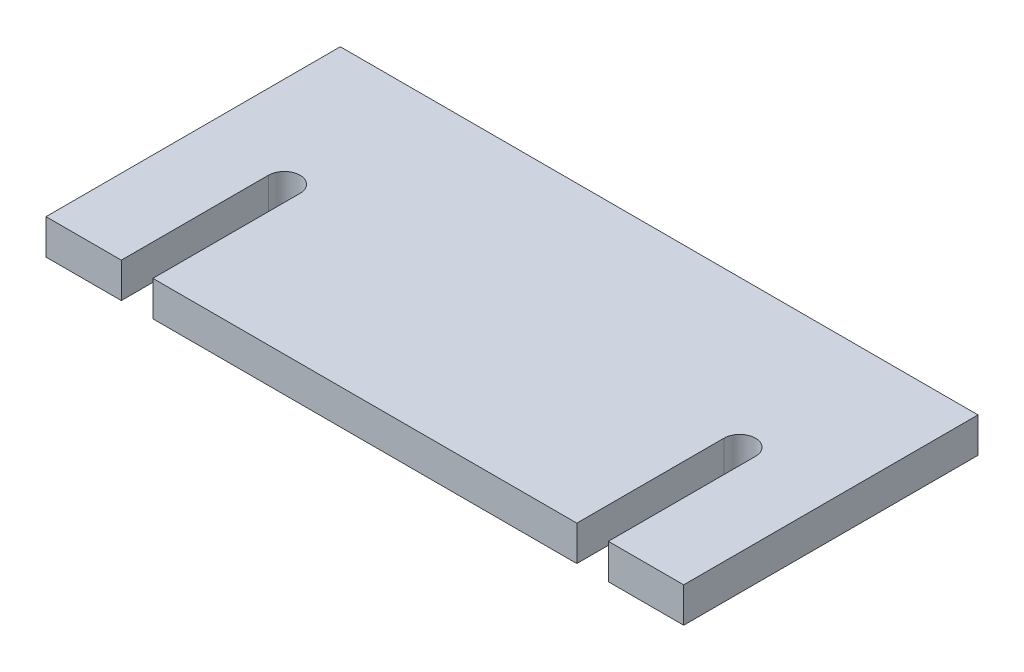
ISO-10303-21;
HEADER;
FILE_DESCRIPTION(('STEP AP214'),'2;1');
FILE_NAME('part.step','',(''),(''),'','','');
FILE_SCHEMA(('AUTOMOTIVE_DESIGN { 1 0 10303 214 1 1 1 1 }'));
ENDSEC;
DATA;
#1=APPLICATION_CONTEXT('core data for automotive mechanical design processes');
#2=APPLICATION_PROTOCOL_DEFINITION('international standard','automotive_design',2000,#1);
#3=PRODUCT_CONTEXT('',#1,'mechanical');
#4=PRODUCT('Part','Part','',(#3));
#5=PRODUCT_RELATED_PRODUCT_CATEGORY('part','',(#4));
#6=PRODUCT_DEFINITION_FORMATION('','',#4);
#7=PRODUCT_DEFINITION_CONTEXT('part definition',#1,'design');
#8=PRODUCT_DEFINITION('design','',#6,#7);
#9=PRODUCT_DEFINITION_SHAPE('','',#8);
#10=(LENGTH_UNIT() NAMED_UNIT(*) SI_UNIT(.MILLI.,.METRE.));
#11=(NAMED_UNIT(*) PLANE_ANGLE_UNIT() SI_UNIT($,.RADIAN.));
#12=(NAMED_UNIT(*) SI_UNIT($,.STERADIAN.) SOLID_ANGLE_UNIT());
#13=UNCERTAINTY_MEASURE_WITH_UNIT(LENGTH_MEASURE(1.E-05),#10,'distance_accuracy_value','');
#14=(GEOMETRIC_REPRESENTATION_CONTEXT(3) GLOBAL_UNCERTAINTY_ASSIGNED_CONTEXT((#13)) GLOBAL_UNIT_ASSIGNED_CONTEXT((#10,
#11,#12)) REPRESENTATION_CONTEXT('',''));
#15=CARTESIAN_POINT('',(0.,0.,0.));
#16=DIRECTION('',(0.,0.,1.));
#17=DIRECTION('',(1.,0.,0.));
#18=AXIS2_PLACEMENT_3D('',#15,#16,#17);
#19=CARTESIAN_POINT('',(-45.5,5.,21.));
#20=DIRECTION('',(0.,0.,-1.));
#21=DIRECTION('',(-1.,0.,0.));
#22=AXIS2_PLACEMENT_3D('',#19,#20,#21);
#23=PLANE('',#22);
#24=DIRECTION('',(1.,0.,0.));
#25=VECTOR('',#24,1.);
#26=CARTESIAN_POINT('',(-45.5,5.,21.));
#27=LINE('',#26,#25);
#28=CARTESIAN_POINT('',(-30.25,5.,21.));
#29=VERTEX_POINT('',#28);
#30=CARTESIAN_POINT('',(30.25,5.,21.));
#31=VERTEX_POINT('',#30);
#32=EDGE_CURVE('E198',#29,#31,#27,.T.);
#33=ORIENTED_EDGE('',*,*,#32,.F.);
#34=DIRECTION('',(0.,1.,0.));
#35=VECTOR('',#34,1.);
#36=CARTESIAN_POINT('',(-30.25,0.,21.));
#37=LINE('',#36,#35);
#38=CARTESIAN_POINT('',(-30.25,0.,21.));
#39=VERTEX_POINT('',#38);
#40=EDGE_CURVE('E156',#39,#29,#37,.T.);
#41=ORIENTED_EDGE('',*,*,#40,.F.);
#42=DIRECTION('',(1.,0.,0.));
#43=VECTOR('',#42,1.);
#44=CARTESIAN_POINT('',(-45.5,0.,21.));
#45=LINE('',#44,#43);
#46=CARTESIAN_POINT('',(30.25,0.,21.));
#47=VERTEX_POINT('',#46);
#48=EDGE_CURVE('E58',#39,#47,#45,.T.);
#49=ORIENTED_EDGE('',*,*,#48,.T.);
#50=DIRECTION('',(0.,1.,0.));
#51=VECTOR('',#50,1.);
#52=CARTESIAN_POINT('',(30.25,0.,21.));
#53=LINE('',#52,#51);
#54=EDGE_CURVE('E182',#47,#31,#53,.T.);
#55=ORIENTED_EDGE('',*,*,#54,.T.);
#56=EDGE_LOOP('',(#33,#41,#49,#55));
#57=FACE_BOUND('',#56,.T.);
#58=ADVANCED_FACE('F35',(#57),#23,.F.);
#59=CARTESIAN_POINT('',(34.75,5.,21.));
#60=VERTEX_POINT('',#59);
#61=CARTESIAN_POINT('',(45.5,5.,21.));
#62=VERTEX_POINT('',#61);
#63=EDGE_CURVE('E193',#60,#62,#27,.T.);
#64=ORIENTED_EDGE('',*,*,#63,.F.);
#65=DIRECTION('',(0.,1.,0.));
#66=VECTOR('',#65,1.);
#67=CARTESIAN_POINT('',(34.75,0.,21.));
#68=LINE('',#67,#66);
#69=CARTESIAN_POINT('',(34.75,0.,21.));
#70=VERTEX_POINT('',#69);
#71=EDGE_CURVE('E180',#70,#60,#68,.T.);
#72=ORIENTED_EDGE('',*,*,#71,.F.);
#73=CARTESIAN_POINT('',(45.5,0.,21.));
#74=VERTEX_POINT('',#73);
#75=EDGE_CURVE('E205',#70,#74,#45,.T.);
#76=ORIENTED_EDGE('',*,*,#75,.T.);
#77=DIRECTION('',(0.,-1.,0.));
#78=VECTOR('',#77,1.);
#79=CARTESIAN_POINT('',(45.5,5.,21.));
#80=LINE('',#79,#78);
#81=EDGE_CURVE('E197',#62,#74,#80,.T.);
#82=ORIENTED_EDGE('',*,*,#81,.F.);
#83=EDGE_LOOP('',(#64,#72,#76,#82));
#84=FACE_BOUND('',#83,.T.);
#85=ADVANCED_FACE('F234',(#84),#23,.F.);
#86=CARTESIAN_POINT('',(45.5,5.,21.));
#87=DIRECTION('',(-1.,0.,0.));
#88=DIRECTION('',(0.,0.,1.));
#89=AXIS2_PLACEMENT_3D('',#86,#87,#88);
#90=PLANE('',#89);
#91=DIRECTION('',(0.,0.,-1.));
#92=VECTOR('',#91,1.);
#93=CARTESIAN_POINT('',(45.5,0.,21.));
#94=LINE('',#93,#92);
#95=CARTESIAN_POINT('',(45.5,0.,-21.));
#96=VERTEX_POINT('',#95);
#97=EDGE_CURVE('E179',#74,#96,#94,.T.);
#98=ORIENTED_EDGE('',*,*,#97,.T.);
#99=DIRECTION('',(0.,-1.,0.));
#100=VECTOR('',#99,1.);
#101=CARTESIAN_POINT('',(45.5,5.,-21.));
#102=LINE('',#101,#100);
#103=CARTESIAN_POINT('',(45.5,5.,-21.));
#104=VERTEX_POINT('',#103);
#105=EDGE_CURVE('E11',#104,#96,#102,.T.);
#106=ORIENTED_EDGE('',*,*,#105,.F.);
#107=DIRECTION('',(0.,0.,-1.));
#108=VECTOR('',#107,1.);
#109=CARTESIAN_POINT('',(45.5,5.,21.));
#110=LINE('',#109,#108);
#111=EDGE_CURVE('E185',#62,#104,#110,.T.);
#112=ORIENTED_EDGE('',*,*,#111,.F.);
#113=ORIENTED_EDGE('',*,*,#81,.T.);
#114=EDGE_LOOP('',(#98,#106,#112,#113));
#115=FACE_BOUND('',#114,.T.);
#116=ADVANCED_FACE('F37',(#115),#90,.F.);
#117=CARTESIAN_POINT('',(-45.5,5.,-21.));
#118=DIRECTION('',(0.,0.,1.));
#119=DIRECTION('',(1.,0.,0.));
#120=AXIS2_PLACEMENT_3D('',#117,#118,#119);
#121=PLANE('',#120);
#122=DIRECTION('',(-1.,0.,0.));
#123=VECTOR('',#122,1.);
#124=CARTESIAN_POINT('',(-45.5,0.,-21.));
#125=LINE('',#124,#123);
#126=CARTESIAN_POINT('',(-45.5,0.,-21.));
#127=VERTEX_POINT('',#126);
#128=EDGE_CURVE('E201',#96,#127,#125,.T.);
#129=ORIENTED_EDGE('',*,*,#128,.T.);
#130=DIRECTION('',(0.,-1.,0.));
#131=VECTOR('',#130,1.);
#132=CARTESIAN_POINT('',(-45.5,5.,-21.));
#133=LINE('',#132,#131);
#134=CARTESIAN_POINT('',(-45.5,5.,-21.));
#135=VERTEX_POINT('',#134);
#136=EDGE_CURVE('E43',#135,#127,#133,.T.);
#137=ORIENTED_EDGE('',*,*,#136,.F.);
#138=DIRECTION('',(-1.,0.,0.));
#139=VECTOR('',#138,1.);
#140=CARTESIAN_POINT('',(-45.5,5.,-21.));
#141=LINE('',#140,#139);
#142=EDGE_CURVE('E188',#104,#135,#141,.T.);
#143=ORIENTED_EDGE('',*,*,#142,.F.);
#144=ORIENTED_EDGE('',*,*,#105,.T.);
#145=EDGE_LOOP('',(#129,#137,#143,#144));
#146=FACE_BOUND('',#145,.T.);
#147=ADVANCED_FACE('F227',(#146),#121,.F.);
#148=CARTESIAN_POINT('',(-45.5,5.,21.));
#149=DIRECTION('',(1.,0.,0.));
#150=DIRECTION('',(0.,0.,-1.));
#151=AXIS2_PLACEMENT_3D('',#148,#149,#150);
#152=PLANE('',#151);
#153=DIRECTION('',(0.,0.,1.));
#154=VECTOR('',#153,1.);
#155=CARTESIAN_POINT('',(-45.5,0.,21.));
#156=LINE('',#155,#154);
#157=CARTESIAN_POINT('',(-45.5,0.,21.));
#158=VERTEX_POINT('',#157);
#159=EDGE_CURVE('E203',#127,#158,#156,.T.);
#160=ORIENTED_EDGE('',*,*,#159,.T.);
#161=DIRECTION('',(0.,-1.,0.));
#162=VECTOR('',#161,1.);
#163=CARTESIAN_POINT('',(-45.5,5.,21.));
#164=LINE('',#163,#162);
#165=CARTESIAN_POINT('',(-45.5,5.,21.));
#166=VERTEX_POINT('',#165);
#167=EDGE_CURVE('E209',#166,#158,#164,.T.);
#168=ORIENTED_EDGE('',*,*,#167,.F.);
#169=DIRECTION('',(0.,0.,1.));
#170=VECTOR('',#169,1.);
#171=CARTESIAN_POINT('',(-45.5,5.,21.));
#172=LINE('',#171,#170);
#173=EDGE_CURVE('E191',#135,#166,#172,.T.);
#174=ORIENTED_EDGE('',*,*,#173,.F.);
#175=ORIENTED_EDGE('',*,*,#136,.T.);
#176=EDGE_LOOP('',(#160,#168,#174,#175));
#177=FACE_BOUND('',#176,.T.);
#178=ADVANCED_FACE('F216',(#177),#152,.F.);
#179=CARTESIAN_POINT('',(-34.75,0.,21.));
#180=VERTEX_POINT('',#179);
#181=EDGE_CURVE('E189',#158,#180,#45,.T.);
#182=ORIENTED_EDGE('',*,*,#181,.T.);
#183=DIRECTION('',(0.,1.,0.));
#184=VECTOR('',#183,1.);
#185=CARTESIAN_POINT('',(-34.75,0.,21.));
#186=LINE('',#185,#184);
#187=CARTESIAN_POINT('',(-34.75,5.,21.));
#188=VERTEX_POINT('',#187);
#189=EDGE_CURVE('E50',#180,#188,#186,.T.);
#190=ORIENTED_EDGE('',*,*,#189,.T.);
#191=EDGE_CURVE('E194',#166,#188,#27,.T.);
#192=ORIENTED_EDGE('',*,*,#191,.F.);
#193=ORIENTED_EDGE('',*,*,#167,.T.);
#194=EDGE_LOOP('',(#182,#190,#192,#193));
#195=FACE_BOUND('',#194,.T.);
#196=ADVANCED_FACE('F221',(#195),#23,.F.);
#197=CARTESIAN_POINT('',(0.,5.,0.));
#198=DIRECTION('',(0.,-1.,0.));
#199=DIRECTION('',(0.,0.,-1.));
#200=AXIS2_PLACEMENT_3D('',#197,#198,#199);
#201=PLANE('',#200);
#202=CARTESIAN_POINT('',(-32.5,5.,0.));
#203=DIRECTION('',(0.,1.,0.));
#204=DIRECTION('',(0.,0.,1.));
#205=AXIS2_PLACEMENT_3D('',#202,#203,#204);
#206=CIRCLE('',#205,2.25000000000001);
#207=CARTESIAN_POINT('',(-30.25,5.,0.));
#208=VERTEX_POINT('',#207);
#209=CARTESIAN_POINT('',(-34.75,5.,0.));
#210=VERTEX_POINT('',#209);
#211=EDGE_CURVE('E133',#208,#210,#206,.T.);
#212=ORIENTED_EDGE('',*,*,#211,.F.);
#213=DIRECTION('',(0.,0.,-1.));
#214=VECTOR('',#213,1.);
#215=CARTESIAN_POINT('',(-30.25,5.,0.));
#216=LINE('',#215,#214);
#217=EDGE_CURVE('E144',#29,#208,#216,.T.);
#218=ORIENTED_EDGE('',*,*,#217,.F.);
#219=ORIENTED_EDGE('',*,*,#32,.T.);
#220=DIRECTION('',(0.,0.,1.));
#221=VECTOR('',#220,1.);
#222=CARTESIAN_POINT('',(30.25,5.,0.));
#223=LINE('',#222,#221);
#224=CARTESIAN_POINT('',(30.25,5.,0.));
#225=VERTEX_POINT('',#224);
#226=EDGE_CURVE('E172',#225,#31,#223,.T.);
#227=ORIENTED_EDGE('',*,*,#226,.F.);
#228=CARTESIAN_POINT('',(32.5,5.,0.));
#229=DIRECTION('',(0.,1.,0.));
#230=DIRECTION('',(0.,0.,1.));
#231=AXIS2_PLACEMENT_3D('',#228,#229,#230);
#232=CIRCLE('',#231,2.24999999999999);
#233=CARTESIAN_POINT('',(34.75,5.,0.));
#234=VERTEX_POINT('',#233);
#235=EDGE_CURVE('E155',#234,#225,#232,.T.);
#236=ORIENTED_EDGE('',*,*,#235,.F.);
#237=DIRECTION('',(0.,0.,-1.));
#238=VECTOR('',#237,1.);
#239=CARTESIAN_POINT('',(34.75,5.,0.));
#240=LINE('',#239,#238);
#241=EDGE_CURVE('E163',#60,#234,#240,.T.);
#242=ORIENTED_EDGE('',*,*,#241,.F.);
#243=ORIENTED_EDGE('',*,*,#63,.T.);
#244=ORIENTED_EDGE('',*,*,#111,.T.);
#245=ORIENTED_EDGE('',*,*,#142,.T.);
#246=ORIENTED_EDGE('',*,*,#173,.T.);
#247=ORIENTED_EDGE('',*,*,#191,.T.);
#248=DIRECTION('',(0.,0.,1.));
#249=VECTOR('',#248,1.);
#250=CARTESIAN_POINT('',(-34.75,5.,0.));
#251=LINE('',#250,#249);
#252=EDGE_CURVE('E147',#210,#188,#251,.T.);
#253=ORIENTED_EDGE('',*,*,#252,.F.);
#254=EDGE_LOOP('',(#212,#218,#219,#227,#236,#242,#243,#244,#245,#246,#247,#253));
#255=FACE_BOUND('',#254,.T.);
#256=ADVANCED_FACE('F224',(#255),#201,.F.);
#257=CARTESIAN_POINT('',(0.,0.,0.));
#258=DIRECTION('',(0.,-1.,0.));
#259=DIRECTION('',(0.,0.,-1.));
#260=AXIS2_PLACEMENT_3D('',#257,#258,#259);
#261=PLANE('',#260);
#262=DIRECTION('',(0.,0.,-1.));
#263=VECTOR('',#262,1.);
#264=CARTESIAN_POINT('',(-30.25,0.,0.));
#265=LINE('',#264,#263);
#266=CARTESIAN_POINT('',(-30.25,0.,0.));
#267=VERTEX_POINT('',#266);
#268=EDGE_CURVE('E135',#39,#267,#265,.T.);
#269=ORIENTED_EDGE('',*,*,#268,.T.);
#270=CARTESIAN_POINT('',(-32.5,0.,0.));
#271=DIRECTION('',(0.,1.,0.));
#272=DIRECTION('',(0.,0.,1.));
#273=AXIS2_PLACEMENT_3D('',#270,#271,#272);
#274=CIRCLE('',#273,2.25000000000001);
#275=CARTESIAN_POINT('',(-34.75,0.,0.));
#276=VERTEX_POINT('',#275);
#277=EDGE_CURVE('E130',#267,#276,#274,.T.);
#278=ORIENTED_EDGE('',*,*,#277,.T.);
#279=DIRECTION('',(0.,0.,1.));
#280=VECTOR('',#279,1.);
#281=CARTESIAN_POINT('',(-34.75,0.,0.));
#282=LINE('',#281,#280);
#283=EDGE_CURVE('E137',#276,#180,#282,.T.);
#284=ORIENTED_EDGE('',*,*,#283,.T.);
#285=ORIENTED_EDGE('',*,*,#181,.F.);
#286=ORIENTED_EDGE('',*,*,#159,.F.);
#287=ORIENTED_EDGE('',*,*,#128,.F.);
#288=ORIENTED_EDGE('',*,*,#97,.F.);
#289=ORIENTED_EDGE('',*,*,#75,.F.);
#290=DIRECTION('',(0.,0.,-1.));
#291=VECTOR('',#290,1.);
#292=CARTESIAN_POINT('',(34.75,0.,0.));
#293=LINE('',#292,#291);
#294=CARTESIAN_POINT('',(34.75,0.,0.));
#295=VERTEX_POINT('',#294);
#296=EDGE_CURVE('E166',#70,#295,#293,.T.);
#297=ORIENTED_EDGE('',*,*,#296,.T.);
#298=CARTESIAN_POINT('',(32.5,0.,0.));
#299=DIRECTION('',(0.,1.,0.));
#300=DIRECTION('',(0.,0.,1.));
#301=AXIS2_PLACEMENT_3D('',#298,#299,#300);
#302=CIRCLE('',#301,2.24999999999999);
#303=CARTESIAN_POINT('',(30.25,0.,0.));
#304=VERTEX_POINT('',#303);
#305=EDGE_CURVE('E159',#295,#304,#302,.T.);
#306=ORIENTED_EDGE('',*,*,#305,.T.);
#307=DIRECTION('',(0.,0.,1.));
#308=VECTOR('',#307,1.);
#309=CARTESIAN_POINT('',(30.25,0.,0.));
#310=LINE('',#309,#308);
#311=EDGE_CURVE('E162',#304,#47,#310,.T.);
#312=ORIENTED_EDGE('',*,*,#311,.T.);
#313=ORIENTED_EDGE('',*,*,#48,.F.);
#314=EDGE_LOOP('',(#269,#278,#284,#285,#286,#287,#288,#289,#297,#306,#312,#313));
#315=FACE_BOUND('',#314,.T.);
#316=ADVANCED_FACE('F143',(#315),#261,.T.);
#317=CARTESIAN_POINT('',(32.5,0.,0.));
#318=DIRECTION('',(0.,1.,0.));
#319=DIRECTION('',(0.,0.,1.));
#320=AXIS2_PLACEMENT_3D('',#317,#318,#319);
#321=CYLINDRICAL_SURFACE('',#320,2.24999999999999);
#322=ORIENTED_EDGE('',*,*,#235,.T.);
#323=DIRECTION('',(0.,1.,0.));
#324=VECTOR('',#323,1.);
#325=CARTESIAN_POINT('',(30.25,0.,0.));
#326=LINE('',#325,#324);
#327=EDGE_CURVE('E169',#304,#225,#326,.T.);
#328=ORIENTED_EDGE('',*,*,#327,.F.);
#329=ORIENTED_EDGE('',*,*,#305,.F.);
#330=DIRECTION('',(0.,1.,0.));
#331=VECTOR('',#330,1.);
#332=CARTESIAN_POINT('',(34.75,0.,0.));
#333=LINE('',#332,#331);
#334=EDGE_CURVE('E177',#295,#234,#333,.T.);
#335=ORIENTED_EDGE('',*,*,#334,.T.);
#336=EDGE_LOOP('',(#322,#328,#329,#335));
#337=FACE_BOUND('',#336,.T.);
#338=ADVANCED_FACE('F241',(#337),#321,.F.);
#339=CARTESIAN_POINT('',(34.75,0.,0.));
#340=DIRECTION('',(1.,0.,0.));
#341=DIRECTION('',(0.,0.,-1.));
#342=AXIS2_PLACEMENT_3D('',#339,#340,#341);
#343=PLANE('',#342);
#344=ORIENTED_EDGE('',*,*,#241,.T.);
#345=ORIENTED_EDGE('',*,*,#334,.F.);
#346=ORIENTED_EDGE('',*,*,#296,.F.);
#347=ORIENTED_EDGE('',*,*,#71,.T.);
#348=EDGE_LOOP('',(#344,#345,#346,#347));
#349=FACE_BOUND('',#348,.T.);
#350=ADVANCED_FACE('F237',(#349),#343,.F.);
#351=CARTESIAN_POINT('',(30.25,0.,0.));
#352=DIRECTION('',(-1.,0.,0.));
#353=DIRECTION('',(0.,0.,1.));
#354=AXIS2_PLACEMENT_3D('',#351,#352,#353);
#355=PLANE('',#354);
#356=ORIENTED_EDGE('',*,*,#226,.T.);
#357=ORIENTED_EDGE('',*,*,#54,.F.);
#358=ORIENTED_EDGE('',*,*,#311,.F.);
#359=ORIENTED_EDGE('',*,*,#327,.T.);
#360=EDGE_LOOP('',(#356,#357,#358,#359));
#361=FACE_BOUND('',#360,.T.);
#362=ADVANCED_FACE('F245',(#361),#355,.F.);
#363=CARTESIAN_POINT('',(-32.5,0.,0.));
#364=DIRECTION('',(0.,1.,0.));
#365=DIRECTION('',(0.,0.,1.));
#366=AXIS2_PLACEMENT_3D('',#363,#364,#365);
#367=CYLINDRICAL_SURFACE('',#366,2.25000000000001);
#368=ORIENTED_EDGE('',*,*,#211,.T.);
#369=DIRECTION('',(0.,1.,0.));
#370=VECTOR('',#369,1.);
#371=CARTESIAN_POINT('',(-34.75,0.,0.));
#372=LINE('',#371,#370);
#373=EDGE_CURVE('E127',#276,#210,#372,.T.);
#374=ORIENTED_EDGE('',*,*,#373,.F.);
#375=ORIENTED_EDGE('',*,*,#277,.F.);
#376=DIRECTION('',(0.,1.,0.));
#377=VECTOR('',#376,1.);
#378=CARTESIAN_POINT('',(-30.25,0.,0.));
#379=LINE('',#378,#377);
#380=EDGE_CURVE('E153',#267,#208,#379,.T.);
#381=ORIENTED_EDGE('',*,*,#380,.T.);
#382=EDGE_LOOP('',(#368,#374,#375,#381));
#383=FACE_BOUND('',#382,.T.);
#384=ADVANCED_FACE('F128',(#383),#367,.F.);
#385=CARTESIAN_POINT('',(-30.25,0.,0.));
#386=DIRECTION('',(1.,0.,0.));
#387=DIRECTION('',(0.,0.,-1.));
#388=AXIS2_PLACEMENT_3D('',#385,#386,#387);
#389=PLANE('',#388);
#390=ORIENTED_EDGE('',*,*,#217,.T.);
#391=ORIENTED_EDGE('',*,*,#380,.F.);
#392=ORIENTED_EDGE('',*,*,#268,.F.);
#393=ORIENTED_EDGE('',*,*,#40,.T.);
#394=EDGE_LOOP('',(#390,#391,#392,#393));
#395=FACE_BOUND('',#394,.T.);
#396=ADVANCED_FACE('F249',(#395),#389,.F.);
#397=CARTESIAN_POINT('',(-34.75,0.,0.));
#398=DIRECTION('',(-1.,0.,0.));
#399=DIRECTION('',(0.,0.,1.));
#400=AXIS2_PLACEMENT_3D('',#397,#398,#399);
#401=PLANE('',#400);
#402=ORIENTED_EDGE('',*,*,#252,.T.);
#403=ORIENTED_EDGE('',*,*,#189,.F.);
#404=ORIENTED_EDGE('',*,*,#283,.F.);
#405=ORIENTED_EDGE('',*,*,#373,.T.);
#406=EDGE_LOOP('',(#402,#403,#404,#405));
#407=FACE_BOUND('',#406,.T.);
#408=ADVANCED_FACE('F138',(#407),#401,.F.);
#409=CLOSED_SHELL('',(#58,#85,#116,#147,#178,#196,#256,#316,#338,#350,#362,#384,#396,#408));
#410=MANIFOLD_SOLID_BREP('B2',#409);
#411=ADVANCED_BREP_SHAPE_REPRESENTATION('',(#18,#410),#14);
#412=SHAPE_DEFINITION_REPRESENTATION(#9,#411);
ENDSEC;
END-ISO-10303-21;
